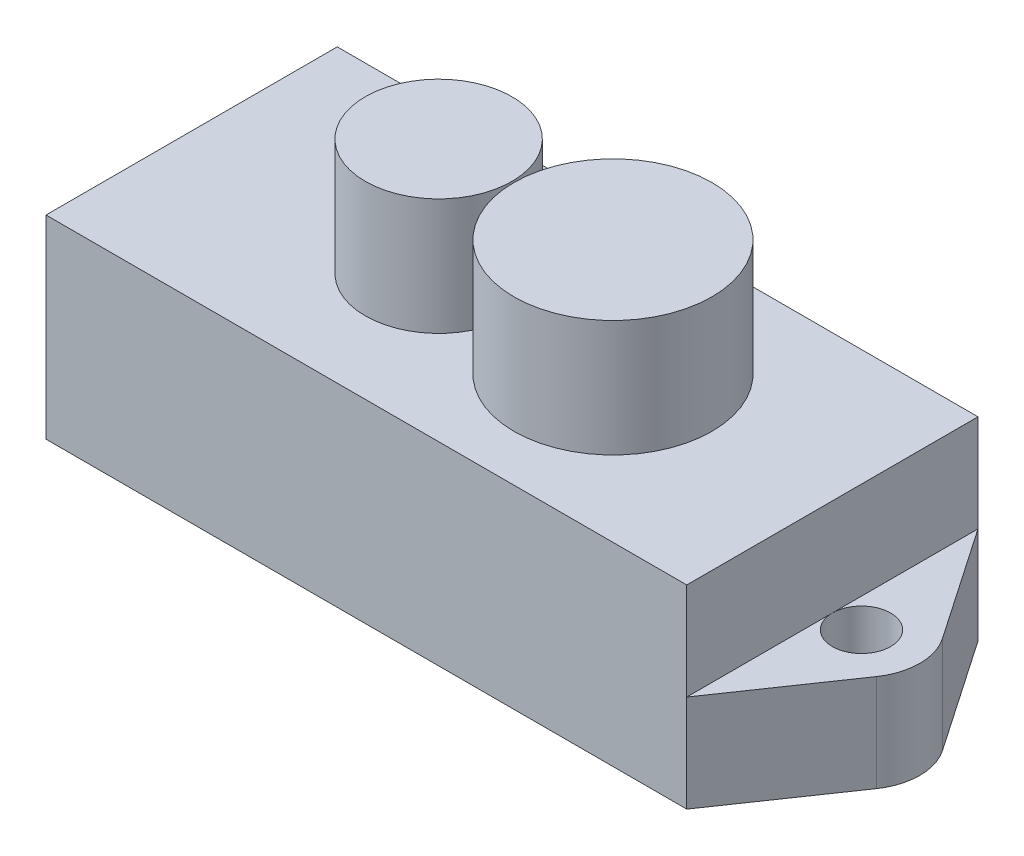
ISO-10303-21;
HEADER;
FILE_DESCRIPTION(('STEP AP214'),'2;1');
FILE_NAME('part.step','',(''),(''),'','','');
FILE_SCHEMA(('AUTOMOTIVE_DESIGN { 1 0 10303 214 1 1 1 1 }'));
ENDSEC;
DATA;
#1=APPLICATION_CONTEXT('core data for automotive mechanical design processes');
#2=APPLICATION_PROTOCOL_DEFINITION('international standard','automotive_design',2000,#1);
#3=PRODUCT_CONTEXT('',#1,'mechanical');
#4=PRODUCT('Part','Part','',(#3));
#5=PRODUCT_RELATED_PRODUCT_CATEGORY('part','',(#4));
#6=PRODUCT_DEFINITION_FORMATION('','',#4);
#7=PRODUCT_DEFINITION_CONTEXT('part definition',#1,'design');
#8=PRODUCT_DEFINITION('design','',#6,#7);
#9=PRODUCT_DEFINITION_SHAPE('','',#8);
#10=(LENGTH_UNIT() NAMED_UNIT(*) SI_UNIT(.MILLI.,.METRE.));
#11=(NAMED_UNIT(*) PLANE_ANGLE_UNIT() SI_UNIT($,.RADIAN.));
#12=(NAMED_UNIT(*) SI_UNIT($,.STERADIAN.) SOLID_ANGLE_UNIT());
#13=UNCERTAINTY_MEASURE_WITH_UNIT(LENGTH_MEASURE(1.E-05),#10,'distance_accuracy_value','');
#14=(GEOMETRIC_REPRESENTATION_CONTEXT(3) GLOBAL_UNCERTAINTY_ASSIGNED_CONTEXT((#13)) GLOBAL_UNIT_ASSIGNED_CONTEXT((#10,
#11,#12)) REPRESENTATION_CONTEXT('',''));
#15=CARTESIAN_POINT('',(0.,0.,0.));
#16=DIRECTION('',(0.,0.,1.));
#17=DIRECTION('',(1.,0.,0.));
#18=AXIS2_PLACEMENT_3D('',#15,#16,#17);
#19=CARTESIAN_POINT('',(-14.7288646047259,5.,-10.086348588393));
#20=DIRECTION('',(-0.825079953812198,0.,-0.565015990762439));
#21=DIRECTION('',(-0.565015990762439,0.,0.825079953812198));
#22=AXIS2_PLACEMENT_3D('',#19,#20,#21);
#23=PLANE('',#22);
#24=DIRECTION('',(0.565015990762439,0.,-0.825079953812198));
#25=VECTOR('',#24,1.);
#26=CARTESIAN_POINT('',(-14.7288646047259,0.,-10.086348588393));
#27=LINE('',#26,#25);
#28=CARTESIAN_POINT('',(-20.4752398614366,0.,-1.69504797228732));
#29=VERTEX_POINT('',#28);
#30=CARTESIAN_POINT('',(-16.5,0.,-7.5));
#31=VERTEX_POINT('',#30);
#32=EDGE_CURVE('E186',#29,#31,#27,.T.);
#33=ORIENTED_EDGE('',*,*,#32,.F.);
#34=DIRECTION('',(0.,-1.,0.));
#35=VECTOR('',#34,1.);
#36=CARTESIAN_POINT('',(-20.4752398614366,5.,-1.69504797228732));
#37=LINE('',#36,#35);
#38=CARTESIAN_POINT('',(-20.4752398614366,5.,-1.69504797228732));
#39=VERTEX_POINT('',#38);
#40=EDGE_CURVE('E11',#39,#29,#37,.T.);
#41=ORIENTED_EDGE('',*,*,#40,.F.);
#42=DIRECTION('',(0.565015990762439,0.,-0.825079953812198));
#43=VECTOR('',#42,1.);
#44=CARTESIAN_POINT('',(-14.7288646047259,5.,-10.086348588393));
#45=LINE('',#44,#43);
#46=CARTESIAN_POINT('',(-16.5,5.,-7.5));
#47=VERTEX_POINT('',#46);
#48=EDGE_CURVE('E187',#39,#47,#45,.T.);
#49=ORIENTED_EDGE('',*,*,#48,.T.);
#50=DIRECTION('',(0.,-1.,0.));
#51=VECTOR('',#50,1.);
#52=CARTESIAN_POINT('',(-16.5,5.,-7.5));
#53=LINE('',#52,#51);
#54=EDGE_CURVE('E199',#47,#31,#53,.T.);
#55=ORIENTED_EDGE('',*,*,#54,.T.);
#56=EDGE_LOOP('',(#33,#41,#49,#55));
#57=FACE_BOUND('',#56,.T.);
#58=ADVANCED_FACE('F35',(#57),#23,.T.);
#59=CARTESIAN_POINT('',(-18.,5.,0.));
#60=DIRECTION('',(0.,-1.,0.));
#61=DIRECTION('',(0.,0.,-1.));
#62=AXIS2_PLACEMENT_3D('',#59,#60,#61);
#63=CYLINDRICAL_SURFACE('',#62,3.);
#64=CARTESIAN_POINT('',(-18.,0.,0.));
#65=DIRECTION('',(0.,1.,0.));
#66=DIRECTION('',(0.,0.,1.));
#67=AXIS2_PLACEMENT_3D('',#64,#65,#66);
#68=CIRCLE('',#67,3.);
#69=CARTESIAN_POINT('',(-20.4752398614366,0.,1.69504797228732));
#70=VERTEX_POINT('',#69);
#71=EDGE_CURVE('E202',#29,#70,#68,.T.);
#72=ORIENTED_EDGE('',*,*,#71,.T.);
#73=DIRECTION('',(0.,-1.,0.));
#74=VECTOR('',#73,1.);
#75=CARTESIAN_POINT('',(-20.4752398614366,5.,1.69504797228732));
#76=LINE('',#75,#74);
#77=CARTESIAN_POINT('',(-20.4752398614366,5.,1.69504797228732));
#78=VERTEX_POINT('',#77);
#79=EDGE_CURVE('E42',#78,#70,#76,.T.);
#80=ORIENTED_EDGE('',*,*,#79,.F.);
#81=CARTESIAN_POINT('',(-18.,5.,0.));
#82=DIRECTION('',(0.,1.,0.));
#83=DIRECTION('',(0.,0.,1.));
#84=AXIS2_PLACEMENT_3D('',#81,#82,#83);
#85=CIRCLE('',#84,3.);
#86=EDGE_CURVE('E189',#39,#78,#85,.T.);
#87=ORIENTED_EDGE('',*,*,#86,.F.);
#88=ORIENTED_EDGE('',*,*,#40,.T.);
#89=EDGE_LOOP('',(#72,#80,#87,#88));
#90=FACE_BOUND('',#89,.T.);
#91=ADVANCED_FACE('F291',(#90),#63,.T.);
#92=CARTESIAN_POINT('',(-14.7288646047259,5.,10.086348588393));
#93=DIRECTION('',(0.825079953812198,0.,-0.56501599076244));
#94=DIRECTION('',(-0.56501599076244,0.,-0.825079953812198));
#95=AXIS2_PLACEMENT_3D('',#92,#93,#94);
#96=PLANE('',#95);
#97=DIRECTION('',(0.56501599076244,0.,0.825079953812198));
#98=VECTOR('',#97,1.);
#99=CARTESIAN_POINT('',(-14.7288646047259,0.,10.086348588393));
#100=LINE('',#99,#98);
#101=CARTESIAN_POINT('',(-16.5,0.,7.5));
#102=VERTEX_POINT('',#101);
#103=EDGE_CURVE('E190',#70,#102,#100,.T.);
#104=ORIENTED_EDGE('',*,*,#103,.T.);
#105=DIRECTION('',(0.,-1.,0.));
#106=VECTOR('',#105,1.);
#107=CARTESIAN_POINT('',(-16.5,5.,7.5));
#108=LINE('',#107,#106);
#109=CARTESIAN_POINT('',(-16.5,5.,7.5));
#110=VERTEX_POINT('',#109);
#111=EDGE_CURVE('E206',#110,#102,#108,.T.);
#112=ORIENTED_EDGE('',*,*,#111,.F.);
#113=DIRECTION('',(0.56501599076244,0.,0.825079953812198));
#114=VECTOR('',#113,1.);
#115=CARTESIAN_POINT('',(-14.7288646047259,5.,10.086348588393));
#116=LINE('',#115,#114);
#117=EDGE_CURVE('E192',#78,#110,#116,.T.);
#118=ORIENTED_EDGE('',*,*,#117,.F.);
#119=ORIENTED_EDGE('',*,*,#79,.T.);
#120=EDGE_LOOP('',(#104,#112,#118,#119));
#121=FACE_BOUND('',#120,.T.);
#122=ADVANCED_FACE('F213',(#121),#96,.F.);
#123=CARTESIAN_POINT('',(0.,5.,0.));
#124=DIRECTION('',(0.,1.,0.));
#125=DIRECTION('',(0.,0.,1.));
#126=AXIS2_PLACEMENT_3D('',#123,#124,#125);
#127=PLANE('',#126);
#128=DIRECTION('',(0.,0.,1.));
#129=VECTOR('',#128,1.);
#130=CARTESIAN_POINT('',(-16.5,5.,0.));
#131=LINE('',#130,#129);
#132=CARTESIAN_POINT('',(-16.5,5.,0.));
#133=VERTEX_POINT('',#132);
#134=EDGE_CURVE('E195',#133,#110,#131,.T.);
#135=ORIENTED_EDGE('',*,*,#134,.F.);
#136=CARTESIAN_POINT('',(-18.,5.,0.));
#137=DIRECTION('',(0.,1.,0.));
#138=DIRECTION('',(0.,0.,1.));
#139=AXIS2_PLACEMENT_3D('',#136,#137,#138);
#140=CIRCLE('',#139,1.5);
#141=EDGE_CURVE('E47',#133,#133,#140,.T.);
#142=ORIENTED_EDGE('',*,*,#141,.F.);
#143=EDGE_CURVE('E196',#47,#133,#131,.T.);
#144=ORIENTED_EDGE('',*,*,#143,.F.);
#145=ORIENTED_EDGE('',*,*,#48,.F.);
#146=ORIENTED_EDGE('',*,*,#86,.T.);
#147=ORIENTED_EDGE('',*,*,#117,.T.);
#148=EDGE_LOOP('',(#135,#142,#144,#145,#146,#147));
#149=FACE_BOUND('',#148,.T.);
#150=ADVANCED_FACE('F300',(#149),#127,.T.);
#151=CARTESIAN_POINT('',(0.,0.,0.));
#152=DIRECTION('',(0.,1.,0.));
#153=DIRECTION('',(0.,0.,1.));
#154=AXIS2_PLACEMENT_3D('',#151,#152,#153);
#155=PLANE('',#154);
#156=CARTESIAN_POINT('',(-18.,0.,0.));
#157=DIRECTION('',(0.,1.,0.));
#158=DIRECTION('',(0.,0.,1.));
#159=AXIS2_PLACEMENT_3D('',#156,#157,#158);
#160=CIRCLE('',#159,1.5);
#161=CARTESIAN_POINT('',(-18.,0.,1.5));
#162=VERTEX_POINT('',#161);
#163=EDGE_CURVE('E153',#162,#162,#160,.T.);
#164=ORIENTED_EDGE('',*,*,#163,.T.);
#165=EDGE_LOOP('',(#164));
#166=FACE_BOUND('',#165,.T.);
#167=CARTESIAN_POINT('',(18.,0.,0.));
#168=DIRECTION('',(0.,1.,0.));
#169=DIRECTION('',(0.,0.,1.));
#170=AXIS2_PLACEMENT_3D('',#167,#168,#169);
#171=CIRCLE('',#170,1.49999999999999);
#172=CARTESIAN_POINT('',(18.,0.,1.49999999999998));
#173=VERTEX_POINT('',#172);
#174=EDGE_CURVE('E145',#173,#173,#171,.T.);
#175=ORIENTED_EDGE('',*,*,#174,.T.);
#176=EDGE_LOOP('',(#175));
#177=FACE_BOUND('',#176,.T.);
#178=ORIENTED_EDGE('',*,*,#32,.T.);
#179=DIRECTION('',(1.,0.,0.));
#180=VECTOR('',#179,1.);
#181=CARTESIAN_POINT('',(0.,0.,-7.5));
#182=LINE('',#181,#180);
#183=CARTESIAN_POINT('',(16.5,0.,-7.5));
#184=VERTEX_POINT('',#183);
#185=EDGE_CURVE('E125',#31,#184,#182,.T.);
#186=ORIENTED_EDGE('',*,*,#185,.T.);
#187=DIRECTION('',(-0.56501599076244,0.,-0.825079953812198));
#188=VECTOR('',#187,1.);
#189=CARTESIAN_POINT('',(14.7288646047259,0.,-10.086348588393));
#190=LINE('',#189,#188);
#191=CARTESIAN_POINT('',(20.4752398614366,0.,-1.69504797228733));
#192=VERTEX_POINT('',#191);
#193=EDGE_CURVE('E142',#192,#184,#190,.T.);
#194=ORIENTED_EDGE('',*,*,#193,.F.);
#195=CARTESIAN_POINT('',(18.,0.,0.));
#196=DIRECTION('',(0.,1.,0.));
#197=DIRECTION('',(0.,0.,1.));
#198=AXIS2_PLACEMENT_3D('',#195,#196,#197);
#199=CIRCLE('',#198,3.);
#200=CARTESIAN_POINT('',(20.4752398614366,0.,1.69504797228731));
#201=VERTEX_POINT('',#200);
#202=EDGE_CURVE('E121',#192,#201,#199,.F.);
#203=ORIENTED_EDGE('',*,*,#202,.T.);
#204=DIRECTION('',(-0.565015990762439,0.,0.825079953812199));
#205=VECTOR('',#204,1.);
#206=CARTESIAN_POINT('',(14.7288646047259,0.,10.086348588393));
#207=LINE('',#206,#205);
#208=CARTESIAN_POINT('',(16.5,0.,7.5));
#209=VERTEX_POINT('',#208);
#210=EDGE_CURVE('E139',#201,#209,#207,.T.);
#211=ORIENTED_EDGE('',*,*,#210,.T.);
#212=DIRECTION('',(1.,0.,0.));
#213=VECTOR('',#212,1.);
#214=CARTESIAN_POINT('',(0.,0.,7.5));
#215=LINE('',#214,#213);
#216=EDGE_CURVE('E164',#102,#209,#215,.T.);
#217=ORIENTED_EDGE('',*,*,#216,.F.);
#218=ORIENTED_EDGE('',*,*,#103,.F.);
#219=ORIENTED_EDGE('',*,*,#71,.F.);
#220=EDGE_LOOP('',(#178,#186,#194,#203,#211,#217,#218,#219));
#221=FACE_BOUND('',#220,.T.);
#222=ADVANCED_FACE('F220',(#166,#177,#221),#155,.F.);
#223=CARTESIAN_POINT('',(-16.5,10.,0.));
#224=DIRECTION('',(1.,0.,0.));
#225=DIRECTION('',(0.,0.,-1.));
#226=AXIS2_PLACEMENT_3D('',#223,#224,#225);
#227=PLANE('',#226);
#228=DIRECTION('',(0.,-1.,0.));
#229=VECTOR('',#228,1.);
#230=CARTESIAN_POINT('',(-16.5,10.,-7.5));
#231=LINE('',#230,#229);
#232=CARTESIAN_POINT('',(-16.5,10.,-7.5));
#233=VERTEX_POINT('',#232);
#234=EDGE_CURVE('E180',#233,#47,#231,.T.);
#235=ORIENTED_EDGE('',*,*,#234,.T.);
#236=ORIENTED_EDGE('',*,*,#143,.T.);
#237=ORIENTED_EDGE('',*,*,#134,.T.);
#238=DIRECTION('',(0.,-1.,0.));
#239=VECTOR('',#238,1.);
#240=CARTESIAN_POINT('',(-16.5,10.,7.5));
#241=LINE('',#240,#239);
#242=CARTESIAN_POINT('',(-16.5,10.,7.5));
#243=VERTEX_POINT('',#242);
#244=EDGE_CURVE('E177',#243,#110,#241,.T.);
#245=ORIENTED_EDGE('',*,*,#244,.F.);
#246=DIRECTION('',(0.,0.,1.));
#247=VECTOR('',#246,1.);
#248=CARTESIAN_POINT('',(-16.5,10.,0.));
#249=LINE('',#248,#247);
#250=EDGE_CURVE('E167',#233,#243,#249,.T.);
#251=ORIENTED_EDGE('',*,*,#250,.F.);
#252=EDGE_LOOP('',(#235,#236,#237,#245,#251));
#253=FACE_BOUND('',#252,.T.);
#254=ADVANCED_FACE('F302',(#253),#227,.F.);
#255=CARTESIAN_POINT('',(16.5,10.,0.));
#256=DIRECTION('',(1.,0.,0.));
#257=DIRECTION('',(0.,0.,-1.));
#258=AXIS2_PLACEMENT_3D('',#255,#256,#257);
#259=PLANE('',#258);
#260=DIRECTION('',(0.,0.,1.));
#261=VECTOR('',#260,1.);
#262=CARTESIAN_POINT('',(16.5,5.,0.));
#263=LINE('',#262,#261);
#264=CARTESIAN_POINT('',(16.5,5.,-7.5));
#265=VERTEX_POINT('',#264);
#266=CARTESIAN_POINT('',(16.5,5.,0.));
#267=VERTEX_POINT('',#266);
#268=EDGE_CURVE('E148',#265,#267,#263,.T.);
#269=ORIENTED_EDGE('',*,*,#268,.F.);
#270=DIRECTION('',(0.,-1.,0.));
#271=VECTOR('',#270,1.);
#272=CARTESIAN_POINT('',(16.5,10.,-7.5));
#273=LINE('',#272,#271);
#274=CARTESIAN_POINT('',(16.5,10.,-7.5));
#275=VERTEX_POINT('',#274);
#276=EDGE_CURVE('E183',#275,#265,#273,.T.);
#277=ORIENTED_EDGE('',*,*,#276,.F.);
#278=DIRECTION('',(0.,0.,1.));
#279=VECTOR('',#278,1.);
#280=CARTESIAN_POINT('',(16.5,10.,0.));
#281=LINE('',#280,#279);
#282=CARTESIAN_POINT('',(16.5,10.,7.5));
#283=VERTEX_POINT('',#282);
#284=EDGE_CURVE('E160',#275,#283,#281,.T.);
#285=ORIENTED_EDGE('',*,*,#284,.T.);
#286=DIRECTION('',(0.,-1.,0.));
#287=VECTOR('',#286,1.);
#288=CARTESIAN_POINT('',(16.5,10.,7.5));
#289=LINE('',#288,#287);
#290=CARTESIAN_POINT('',(16.5,5.,7.5));
#291=VERTEX_POINT('',#290);
#292=EDGE_CURVE('E171',#283,#291,#289,.T.);
#293=ORIENTED_EDGE('',*,*,#292,.T.);
#294=EDGE_CURVE('E134',#267,#291,#263,.T.);
#295=ORIENTED_EDGE('',*,*,#294,.F.);
#296=EDGE_LOOP('',(#269,#277,#285,#293,#295));
#297=FACE_BOUND('',#296,.T.);
#298=ADVANCED_FACE('F236',(#297),#259,.T.);
#299=CARTESIAN_POINT('',(0.,10.,-7.5));
#300=DIRECTION('',(0.,0.,-1.));
#301=DIRECTION('',(-1.,0.,0.));
#302=AXIS2_PLACEMENT_3D('',#299,#300,#301);
#303=PLANE('',#302);
#304=ORIENTED_EDGE('',*,*,#185,.F.);
#305=ORIENTED_EDGE('',*,*,#54,.F.);
#306=ORIENTED_EDGE('',*,*,#234,.F.);
#307=DIRECTION('',(1.,0.,0.));
#308=VECTOR('',#307,1.);
#309=CARTESIAN_POINT('',(0.,10.,-7.5));
#310=LINE('',#309,#308);
#311=EDGE_CURVE('E163',#233,#275,#310,.T.);
#312=ORIENTED_EDGE('',*,*,#311,.T.);
#313=ORIENTED_EDGE('',*,*,#276,.T.);
#314=DIRECTION('',(0.,-1.,0.));
#315=VECTOR('',#314,1.);
#316=CARTESIAN_POINT('',(16.5,5.,-7.5));
#317=LINE('',#316,#315);
#318=EDGE_CURVE('E126',#265,#184,#317,.T.);
#319=ORIENTED_EDGE('',*,*,#318,.T.);
#320=EDGE_LOOP('',(#304,#305,#306,#312,#313,#319));
#321=FACE_BOUND('',#320,.T.);
#322=ADVANCED_FACE('F232',(#321),#303,.T.);
#323=CARTESIAN_POINT('',(0.,10.,7.5));
#324=DIRECTION('',(0.,0.,-1.));
#325=DIRECTION('',(-1.,0.,0.));
#326=AXIS2_PLACEMENT_3D('',#323,#324,#325);
#327=PLANE('',#326);
#328=ORIENTED_EDGE('',*,*,#216,.T.);
#329=DIRECTION('',(0.,-1.,0.));
#330=VECTOR('',#329,1.);
#331=CARTESIAN_POINT('',(16.5,5.,7.5));
#332=LINE('',#331,#330);
#333=EDGE_CURVE('E156',#291,#209,#332,.T.);
#334=ORIENTED_EDGE('',*,*,#333,.F.);
#335=ORIENTED_EDGE('',*,*,#292,.F.);
#336=DIRECTION('',(1.,0.,0.));
#337=VECTOR('',#336,1.);
#338=CARTESIAN_POINT('',(0.,10.,7.5));
#339=LINE('',#338,#337);
#340=EDGE_CURVE('E169',#243,#283,#339,.T.);
#341=ORIENTED_EDGE('',*,*,#340,.F.);
#342=ORIENTED_EDGE('',*,*,#244,.T.);
#343=ORIENTED_EDGE('',*,*,#111,.T.);
#344=EDGE_LOOP('',(#328,#334,#335,#341,#342,#343));
#345=FACE_BOUND('',#344,.T.);
#346=ADVANCED_FACE('F225',(#345),#327,.F.);
#347=CARTESIAN_POINT('',(0.,10.,0.));
#348=DIRECTION('',(0.,1.,0.));
#349=DIRECTION('',(0.,0.,1.));
#350=AXIS2_PLACEMENT_3D('',#347,#348,#349);
#351=PLANE('',#350);
#352=CARTESIAN_POINT('',(5.2,10.,0.));
#353=DIRECTION('',(0.,1.,0.));
#354=DIRECTION('',(0.,0.,1.));
#355=AXIS2_PLACEMENT_3D('',#352,#353,#354);
#356=CIRCLE('',#355,5.1);
#357=CARTESIAN_POINT('',(5.2,10.,5.1));
#358=VERTEX_POINT('',#357);
#359=EDGE_CURVE('E255',#358,#358,#356,.T.);
#360=ORIENTED_EDGE('',*,*,#359,.F.);
#361=EDGE_LOOP('',(#360));
#362=FACE_BOUND('',#361,.T.);
#363=CARTESIAN_POINT('',(-3.777846650732,10.,0.));
#364=DIRECTION('',(0.,1.,0.));
#365=DIRECTION('',(0.,0.,1.));
#366=AXIS2_PLACEMENT_3D('',#363,#364,#365);
#367=CIRCLE('',#366,3.777846650732);
#368=CARTESIAN_POINT('',(-3.777846650732,10.,3.777846650732));
#369=VERTEX_POINT('',#368);
#370=EDGE_CURVE('E249',#369,#369,#367,.T.);
#371=ORIENTED_EDGE('',*,*,#370,.F.);
#372=EDGE_LOOP('',(#371));
#373=FACE_BOUND('',#372,.T.);
#374=ORIENTED_EDGE('',*,*,#284,.F.);
#375=ORIENTED_EDGE('',*,*,#311,.F.);
#376=ORIENTED_EDGE('',*,*,#250,.T.);
#377=ORIENTED_EDGE('',*,*,#340,.T.);
#378=EDGE_LOOP('',(#374,#375,#376,#377));
#379=FACE_BOUND('',#378,.T.);
#380=ADVANCED_FACE('F239',(#362,#373,#379),#351,.T.);
#381=CARTESIAN_POINT('',(18.,5.,0.));
#382=DIRECTION('',(0.,-1.,0.));
#383=DIRECTION('',(0.,0.,-1.));
#384=AXIS2_PLACEMENT_3D('',#381,#382,#383);
#385=CYLINDRICAL_SURFACE('',#384,3.);
#386=ORIENTED_EDGE('',*,*,#202,.F.);
#387=DIRECTION('',(0.,-1.,0.));
#388=VECTOR('',#387,1.);
#389=CARTESIAN_POINT('',(20.4752398614366,5.,-1.69504797228733));
#390=LINE('',#389,#388);
#391=CARTESIAN_POINT('',(20.4752398614366,5.,-1.69504797228733));
#392=VERTEX_POINT('',#391);
#393=EDGE_CURVE('E114',#392,#192,#390,.T.);
#394=ORIENTED_EDGE('',*,*,#393,.F.);
#395=CARTESIAN_POINT('',(18.,5.,0.));
#396=DIRECTION('',(0.,1.,0.));
#397=DIRECTION('',(0.,0.,1.));
#398=AXIS2_PLACEMENT_3D('',#395,#396,#397);
#399=CIRCLE('',#398,3.);
#400=CARTESIAN_POINT('',(20.4752398614366,5.,1.69504797228731));
#401=VERTEX_POINT('',#400);
#402=EDGE_CURVE('E118',#392,#401,#399,.F.);
#403=ORIENTED_EDGE('',*,*,#402,.T.);
#404=DIRECTION('',(0.,-1.,0.));
#405=VECTOR('',#404,1.);
#406=CARTESIAN_POINT('',(20.4752398614366,5.,1.69504797228731));
#407=LINE('',#406,#405);
#408=EDGE_CURVE('E151',#401,#201,#407,.T.);
#409=ORIENTED_EDGE('',*,*,#408,.T.);
#410=EDGE_LOOP('',(#386,#394,#403,#409));
#411=FACE_BOUND('',#410,.T.);
#412=ADVANCED_FACE('F116',(#411),#385,.T.);
#413=CARTESIAN_POINT('',(14.7288646047259,5.,-10.086348588393));
#414=DIRECTION('',(-0.825079953812198,0.,0.56501599076244));
#415=DIRECTION('',(0.56501599076244,0.,0.825079953812198));
#416=AXIS2_PLACEMENT_3D('',#413,#414,#415);
#417=PLANE('',#416);
#418=ORIENTED_EDGE('',*,*,#193,.T.);
#419=ORIENTED_EDGE('',*,*,#318,.F.);
#420=DIRECTION('',(-0.56501599076244,0.,-0.825079953812198));
#421=VECTOR('',#420,1.);
#422=CARTESIAN_POINT('',(14.7288646047259,5.,-10.086348588393));
#423=LINE('',#422,#421);
#424=EDGE_CURVE('E130',#392,#265,#423,.T.);
#425=ORIENTED_EDGE('',*,*,#424,.F.);
#426=ORIENTED_EDGE('',*,*,#393,.T.);
#427=EDGE_LOOP('',(#418,#419,#425,#426));
#428=FACE_BOUND('',#427,.T.);
#429=ADVANCED_FACE('F131',(#428),#417,.F.);
#430=CARTESIAN_POINT('',(14.7288646047259,5.,10.086348588393));
#431=DIRECTION('',(0.825079953812199,0.,0.565015990762439));
#432=DIRECTION('',(0.565015990762439,0.,-0.825079953812199));
#433=AXIS2_PLACEMENT_3D('',#430,#431,#432);
#434=PLANE('',#433);
#435=ORIENTED_EDGE('',*,*,#210,.F.);
#436=ORIENTED_EDGE('',*,*,#408,.F.);
#437=DIRECTION('',(-0.565015990762439,0.,0.825079953812199));
#438=VECTOR('',#437,1.);
#439=CARTESIAN_POINT('',(14.7288646047259,5.,10.086348588393));
#440=LINE('',#439,#438);
#441=EDGE_CURVE('E138',#401,#291,#440,.T.);
#442=ORIENTED_EDGE('',*,*,#441,.T.);
#443=ORIENTED_EDGE('',*,*,#333,.T.);
#444=EDGE_LOOP('',(#435,#436,#442,#443));
#445=FACE_BOUND('',#444,.T.);
#446=ADVANCED_FACE('F228',(#445),#434,.T.);
#447=CARTESIAN_POINT('',(0.,5.,0.));
#448=DIRECTION('',(0.,1.,0.));
#449=DIRECTION('',(0.,0.,1.));
#450=AXIS2_PLACEMENT_3D('',#447,#448,#449);
#451=PLANE('',#450);
#452=ORIENTED_EDGE('',*,*,#268,.T.);
#453=CARTESIAN_POINT('',(18.,5.,0.));
#454=DIRECTION('',(0.,1.,0.));
#455=DIRECTION('',(0.,0.,1.));
#456=AXIS2_PLACEMENT_3D('',#453,#454,#455);
#457=CIRCLE('',#456,1.49999999999999);
#458=EDGE_CURVE('E52',#267,#267,#457,.T.);
#459=ORIENTED_EDGE('',*,*,#458,.F.);
#460=ORIENTED_EDGE('',*,*,#294,.T.);
#461=ORIENTED_EDGE('',*,*,#441,.F.);
#462=ORIENTED_EDGE('',*,*,#402,.F.);
#463=ORIENTED_EDGE('',*,*,#424,.T.);
#464=EDGE_LOOP('',(#452,#459,#460,#461,#462,#463));
#465=FACE_BOUND('',#464,.T.);
#466=ADVANCED_FACE('F136',(#465),#451,.T.);
#467=CARTESIAN_POINT('',(18.,0.,0.));
#468=DIRECTION('',(0.,1.,0.));
#469=DIRECTION('',(0.,0.,1.));
#470=AXIS2_PLACEMENT_3D('',#467,#468,#469);
#471=CYLINDRICAL_SURFACE('',#470,1.49999999999999);
#472=ORIENTED_EDGE('',*,*,#174,.F.);
#473=EDGE_LOOP('',(#472));
#474=FACE_BOUND('',#473,.T.);
#475=ORIENTED_EDGE('',*,*,#458,.T.);
#476=EDGE_LOOP('',(#475));
#477=FACE_BOUND('',#476,.T.);
#478=ADVANCED_FACE('F286',(#474,#477),#471,.F.);
#479=CARTESIAN_POINT('',(-18.,0.,0.));
#480=DIRECTION('',(0.,1.,0.));
#481=DIRECTION('',(0.,0.,1.));
#482=AXIS2_PLACEMENT_3D('',#479,#480,#481);
#483=CYLINDRICAL_SURFACE('',#482,1.5);
#484=ORIENTED_EDGE('',*,*,#163,.F.);
#485=EDGE_LOOP('',(#484));
#486=FACE_BOUND('',#485,.T.);
#487=ORIENTED_EDGE('',*,*,#141,.T.);
#488=EDGE_LOOP('',(#487));
#489=FACE_BOUND('',#488,.T.);
#490=ADVANCED_FACE('F277',(#486,#489),#483,.F.);
#491=CARTESIAN_POINT('',(-3.777846650732,16.,0.));
#492=DIRECTION('',(0.,-1.,0.));
#493=DIRECTION('',(0.,0.,-1.));
#494=AXIS2_PLACEMENT_3D('',#491,#492,#493);
#495=CYLINDRICAL_SURFACE('',#494,3.777846650732);
#496=CARTESIAN_POINT('',(-3.777846650732,16.,0.));
#497=DIRECTION('',(0.,1.,0.));
#498=DIRECTION('',(0.,0.,1.));
#499=AXIS2_PLACEMENT_3D('',#496,#497,#498);
#500=CIRCLE('',#499,3.777846650732);
#501=CARTESIAN_POINT('',(-3.777846650732,16.,3.777846650732));
#502=VERTEX_POINT('',#501);
#503=EDGE_CURVE('E245',#502,#502,#500,.T.);
#504=ORIENTED_EDGE('',*,*,#503,.F.);
#505=EDGE_LOOP('',(#504));
#506=FACE_BOUND('',#505,.T.);
#507=ORIENTED_EDGE('',*,*,#370,.T.);
#508=EDGE_LOOP('',(#507));
#509=FACE_BOUND('',#508,.T.);
#510=ADVANCED_FACE('F275',(#506,#509),#495,.T.);
#511=CARTESIAN_POINT('',(0.,16.,0.));
#512=DIRECTION('',(0.,1.,0.));
#513=DIRECTION('',(0.,0.,1.));
#514=AXIS2_PLACEMENT_3D('',#511,#512,#513);
#515=PLANE('',#514);
#516=ORIENTED_EDGE('',*,*,#503,.T.);
#517=EDGE_LOOP('',(#516));
#518=FACE_BOUND('',#517,.T.);
#519=ADVANCED_FACE('F266',(#518),#515,.T.);
#520=CARTESIAN_POINT('',(5.2,16.,0.));
#521=DIRECTION('',(0.,-1.,0.));
#522=DIRECTION('',(0.,0.,-1.));
#523=AXIS2_PLACEMENT_3D('',#520,#521,#522);
#524=CYLINDRICAL_SURFACE('',#523,5.1);
#525=CARTESIAN_POINT('',(5.2,16.,0.));
#526=DIRECTION('',(0.,1.,0.));
#527=DIRECTION('',(0.,0.,1.));
#528=AXIS2_PLACEMENT_3D('',#525,#526,#527);
#529=CIRCLE('',#528,5.1);
#530=CARTESIAN_POINT('',(5.2,16.,5.1));
#531=VERTEX_POINT('',#530);
#532=EDGE_CURVE('E252',#531,#531,#529,.T.);
#533=ORIENTED_EDGE('',*,*,#532,.F.);
#534=EDGE_LOOP('',(#533));
#535=FACE_BOUND('',#534,.T.);
#536=ORIENTED_EDGE('',*,*,#359,.T.);
#537=EDGE_LOOP('',(#536));
#538=FACE_BOUND('',#537,.T.);
#539=ADVANCED_FACE('F263',(#535,#538),#524,.T.);
#540=CARTESIAN_POINT('',(5.2,16.,0.));
#541=DIRECTION('',(0.,1.,0.));
#542=DIRECTION('',(0.,0.,1.));
#543=AXIS2_PLACEMENT_3D('',#540,#541,#542);
#544=PLANE('',#543);
#545=ORIENTED_EDGE('',*,*,#532,.T.);
#546=EDGE_LOOP('',(#545));
#547=FACE_BOUND('',#546,.T.);
#548=ADVANCED_FACE('F261',(#547),#544,.T.);
#549=CLOSED_SHELL('',(#58,#91,#122,#150,#222,#254,#298,#322,#346,#380,#412,#429,#446,#466,#478,
#490,#510,#519,#539,#548));
#550=MANIFOLD_SOLID_BREP('B2',#549);
#551=ADVANCED_BREP_SHAPE_REPRESENTATION('',(#18,#550),#14);
#552=SHAPE_DEFINITION_REPRESENTATION(#9,#551);
ENDSEC;
END-ISO-10303-21;
